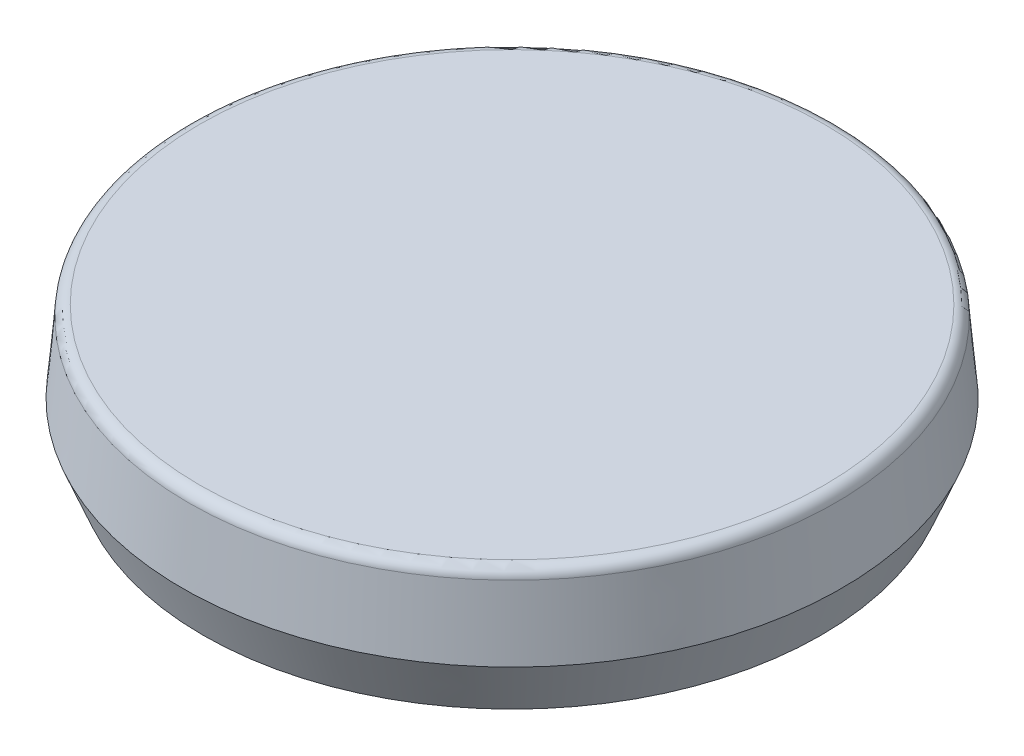
ISO-10303-21;
HEADER;
FILE_DESCRIPTION(('STEP AP214'),'2;1');
FILE_NAME('part.step','',(''),(''),'','','');
FILE_SCHEMA(('AUTOMOTIVE_DESIGN { 1 0 10303 214 1 1 1 1 }'));
ENDSEC;
DATA;
#1=APPLICATION_CONTEXT('core data for automotive mechanical design processes');
#2=APPLICATION_PROTOCOL_DEFINITION('international standard','automotive_design',2000,#1);
#3=PRODUCT_CONTEXT('',#1,'mechanical');
#4=PRODUCT('Part','Part','',(#3));
#5=PRODUCT_RELATED_PRODUCT_CATEGORY('part','',(#4));
#6=PRODUCT_DEFINITION_FORMATION('','',#4);
#7=PRODUCT_DEFINITION_CONTEXT('part definition',#1,'design');
#8=PRODUCT_DEFINITION('design','',#6,#7);
#9=PRODUCT_DEFINITION_SHAPE('','',#8);
#10=(LENGTH_UNIT() NAMED_UNIT(*) SI_UNIT(.MILLI.,.METRE.));
#11=(NAMED_UNIT(*) PLANE_ANGLE_UNIT() SI_UNIT($,.RADIAN.));
#12=(NAMED_UNIT(*) SI_UNIT($,.STERADIAN.) SOLID_ANGLE_UNIT());
#13=UNCERTAINTY_MEASURE_WITH_UNIT(LENGTH_MEASURE(1.E-05),#10,'distance_accuracy_value','');
#14=(GEOMETRIC_REPRESENTATION_CONTEXT(3) GLOBAL_UNCERTAINTY_ASSIGNED_CONTEXT((#13)) GLOBAL_UNIT_ASSIGNED_CONTEXT((#10,
#11,#12)) REPRESENTATION_CONTEXT('',''));
#15=CARTESIAN_POINT('',(0.,0.,0.));
#16=DIRECTION('',(0.,0.,1.));
#17=DIRECTION('',(1.,0.,0.));
#18=AXIS2_PLACEMENT_3D('',#15,#16,#17);
#19=CARTESIAN_POINT('',(0.,0.,0.));
#20=DIRECTION('',(0.,-1.,0.));
#21=DIRECTION('',(0.,0.,-1.));
#22=AXIS2_PLACEMENT_3D('',#19,#20,#21);
#23=PLANE('',#22);
#24=CARTESIAN_POINT('',(0.,0.,0.));
#25=DIRECTION('',(0.,-1.,0.));
#26=DIRECTION('',(0.,0.,-1.));
#27=AXIS2_PLACEMENT_3D('',#24,#25,#26);
#28=CIRCLE('',#27,2.5);
#29=CARTESIAN_POINT('',(0.,0.,-2.5));
#30=VERTEX_POINT('',#29);
#31=EDGE_CURVE('E66',#30,#30,#28,.T.);
#32=ORIENTED_EDGE('',*,*,#31,.F.);
#33=EDGE_LOOP('',(#32));
#34=FACE_BOUND('',#33,.T.);
#35=CARTESIAN_POINT('',(0.,0.,0.));
#36=DIRECTION('',(0.,-1.,0.));
#37=DIRECTION('',(0.,0.,-1.));
#38=AXIS2_PLACEMENT_3D('',#35,#36,#37);
#39=CIRCLE('',#38,2.81269670329205);
#40=CARTESIAN_POINT('',(0.,0.,-2.81269670329205));
#41=VERTEX_POINT('',#40);
#42=EDGE_CURVE('E54',#41,#41,#39,.T.);
#43=ORIENTED_EDGE('',*,*,#42,.T.);
#44=EDGE_LOOP('',(#43));
#45=FACE_BOUND('',#44,.T.);
#46=ADVANCED_FACE('F41',(#34,#45),#23,.T.);
#47=CARTESIAN_POINT('',(0.,0.,0.));
#48=DIRECTION('',(0.,1.,0.));
#49=DIRECTION('',(0.,0.,1.));
#50=AXIS2_PLACEMENT_3D('',#47,#48,#49);
#51=CONICAL_SURFACE('',#50,2.81269670329205,0.383972435438749);
#52=CARTESIAN_POINT('',(0.,0.463591927283394,0.));
#53=DIRECTION('',(0.,-1.,0.));
#54=DIRECTION('',(0.,0.,-1.));
#55=AXIS2_PLACEMENT_3D('',#52,#53,#54);
#56=CIRCLE('',#55,3.);
#57=CARTESIAN_POINT('',(0.,0.463591927283394,-3.));
#58=VERTEX_POINT('',#57);
#59=EDGE_CURVE('E59',#58,#58,#56,.T.);
#60=ORIENTED_EDGE('',*,*,#59,.T.);
#61=EDGE_LOOP('',(#60));
#62=FACE_BOUND('',#61,.T.);
#63=ORIENTED_EDGE('',*,*,#42,.F.);
#64=EDGE_LOOP('',(#63));
#65=FACE_BOUND('',#64,.T.);
#66=ADVANCED_FACE('F84',(#62,#65),#51,.T.);
#67=CARTESIAN_POINT('',(0.,0.463591927283394,0.));
#68=DIRECTION('',(0.,-1.,0.));
#69=DIRECTION('',(0.,0.,-1.));
#70=AXIS2_PLACEMENT_3D('',#67,#68,#69);
#71=CONICAL_SURFACE('',#70,3.,0.0872664625997203);
#72=CARTESIAN_POINT('',(0.,1.10871557427477,0.));
#73=DIRECTION('',(0.,1.,0.));
#74=DIRECTION('',(0.,0.,1.));
#75=AXIS2_PLACEMENT_3D('',#72,#73,#74);
#76=CIRCLE('',#75,2.94355899431575);
#77=CARTESIAN_POINT('',(0.,1.10871557427477,2.94355899431575));
#78=VERTEX_POINT('',#77);
#79=EDGE_CURVE('E49',#78,#78,#76,.F.);
#80=ORIENTED_EDGE('',*,*,#79,.T.);
#81=EDGE_LOOP('',(#80));
#82=FACE_BOUND('',#81,.T.);
#83=ORIENTED_EDGE('',*,*,#59,.F.);
#84=EDGE_LOOP('',(#83));
#85=FACE_BOUND('',#84,.T.);
#86=ADVANCED_FACE('F88',(#82,#85),#71,.T.);
#87=CARTESIAN_POINT('',(2.93557264190832,1.2,0.));
#88=DIRECTION('',(0.,1.,0.));
#89=DIRECTION('',(0.,0.,1.));
#90=AXIS2_PLACEMENT_3D('',#87,#88,#89);
#91=PLANE('',#90);
#92=CARTESIAN_POINT('',(0.,1.2,0.));
#93=DIRECTION('',(0.,1.,0.));
#94=DIRECTION('',(0.,0.,1.));
#95=AXIS2_PLACEMENT_3D('',#92,#93,#94);
#96=CIRCLE('',#95,2.84393952450658);
#97=CARTESIAN_POINT('',(0.,1.2,2.84393952450658));
#98=VERTEX_POINT('',#97);
#99=EDGE_CURVE('E10',#98,#98,#96,.T.);
#100=ORIENTED_EDGE('',*,*,#99,.T.);
#101=EDGE_LOOP('',(#100));
#102=FACE_BOUND('',#101,.T.);
#103=ADVANCED_FACE('F94',(#102),#91,.T.);
#104=CARTESIAN_POINT('',(0.,1.1,0.));
#105=DIRECTION('',(0.,1.,0.));
#106=DIRECTION('',(0.,0.,1.));
#107=AXIS2_PLACEMENT_3D('',#104,#105,#106);
#108=TOROIDAL_SURFACE('',#107,2.84393952450658,0.1);
#109=ORIENTED_EDGE('',*,*,#99,.F.);
#110=EDGE_LOOP('',(#109));
#111=FACE_BOUND('',#110,.T.);
#112=ORIENTED_EDGE('',*,*,#79,.F.);
#113=EDGE_LOOP('',(#112));
#114=FACE_BOUND('',#113,.T.);
#115=ADVANCED_FACE('F43',(#111,#114),#108,.T.);
#116=CARTESIAN_POINT('',(0.,0.5,0.));
#117=DIRECTION('',(0.,-1.,0.));
#118=DIRECTION('',(0.,0.,-1.));
#119=AXIS2_PLACEMENT_3D('',#116,#117,#118);
#120=CYLINDRICAL_SURFACE('',#119,2.5);
#121=CARTESIAN_POINT('',(0.,0.5,0.));
#122=DIRECTION('',(0.,-1.,0.));
#123=DIRECTION('',(0.,0.,-1.));
#124=AXIS2_PLACEMENT_3D('',#121,#122,#123);
#125=CIRCLE('',#124,2.5);
#126=CARTESIAN_POINT('',(0.,0.5,-2.5));
#127=VERTEX_POINT('',#126);
#128=EDGE_CURVE('E65',#127,#127,#125,.T.);
#129=ORIENTED_EDGE('',*,*,#128,.F.);
#130=EDGE_LOOP('',(#129));
#131=FACE_BOUND('',#130,.T.);
#132=ORIENTED_EDGE('',*,*,#31,.T.);
#133=EDGE_LOOP('',(#132));
#134=FACE_BOUND('',#133,.T.);
#135=ADVANCED_FACE('F76',(#131,#134),#120,.F.);
#136=CARTESIAN_POINT('',(0.,0.5,0.));
#137=DIRECTION('',(0.,-1.,0.));
#138=DIRECTION('',(0.,0.,-1.));
#139=AXIS2_PLACEMENT_3D('',#136,#137,#138);
#140=PLANE('',#139);
#141=ORIENTED_EDGE('',*,*,#128,.T.);
#142=EDGE_LOOP('',(#141));
#143=FACE_BOUND('',#142,.T.);
#144=ADVANCED_FACE('F74',(#143),#140,.T.);
#145=CLOSED_SHELL('',(#46,#66,#86,#103,#115,#135,#144));
#146=MANIFOLD_SOLID_BREP('B2',#145);
#147=ADVANCED_BREP_SHAPE_REPRESENTATION('',(#18,#146),#14);
#148=SHAPE_DEFINITION_REPRESENTATION(#9,#147);
ENDSEC;
END-ISO-10303-21;
